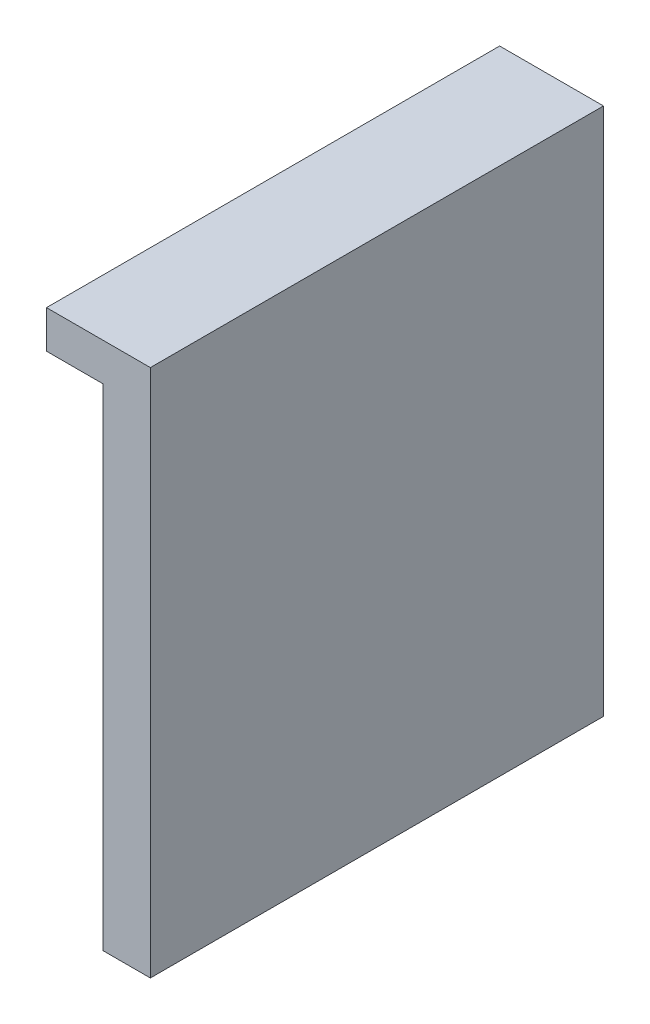
ISO-10303-21;
HEADER;
FILE_DESCRIPTION(('STEP AP214'),'2;1');
FILE_NAME('part.step','',(''),(''),'','','');
FILE_SCHEMA(('AUTOMOTIVE_DESIGN { 1 0 10303 214 1 1 1 1 }'));
ENDSEC;
DATA;
#1=APPLICATION_CONTEXT('core data for automotive mechanical design processes');
#2=APPLICATION_PROTOCOL_DEFINITION('international standard','automotive_design',2000,#1);
#3=PRODUCT_CONTEXT('',#1,'mechanical');
#4=PRODUCT('Part','Part','',(#3));
#5=PRODUCT_RELATED_PRODUCT_CATEGORY('part','',(#4));
#6=PRODUCT_DEFINITION_FORMATION('','',#4);
#7=PRODUCT_DEFINITION_CONTEXT('part definition',#1,'design');
#8=PRODUCT_DEFINITION('design','',#6,#7);
#9=PRODUCT_DEFINITION_SHAPE('','',#8);
#10=(LENGTH_UNIT() NAMED_UNIT(*) SI_UNIT(.MILLI.,.METRE.));
#11=(NAMED_UNIT(*) PLANE_ANGLE_UNIT() SI_UNIT($,.RADIAN.));
#12=(NAMED_UNIT(*) SI_UNIT($,.STERADIAN.) SOLID_ANGLE_UNIT());
#13=UNCERTAINTY_MEASURE_WITH_UNIT(LENGTH_MEASURE(1.E-05),#10,'distance_accuracy_value','');
#14=(GEOMETRIC_REPRESENTATION_CONTEXT(3) GLOBAL_UNCERTAINTY_ASSIGNED_CONTEXT((#13)) GLOBAL_UNIT_ASSIGNED_CONTEXT((#10,
#11,#12)) REPRESENTATION_CONTEXT('',''));
#15=CARTESIAN_POINT('',(0.,0.,0.));
#16=DIRECTION('',(0.,0.,1.));
#17=DIRECTION('',(1.,0.,0.));
#18=AXIS2_PLACEMENT_3D('',#15,#16,#17);
#19=CARTESIAN_POINT('',(0.,23.,-24.));
#20=DIRECTION('',(0.,0.,-1.));
#21=DIRECTION('',(-1.,0.,0.));
#22=AXIS2_PLACEMENT_3D('',#19,#20,#21);
#23=PLANE('',#22);
#24=DIRECTION('',(-1.,0.,0.));
#25=VECTOR('',#24,1.);
#26=CARTESIAN_POINT('',(3.,25.,-24.));
#27=LINE('',#26,#25);
#28=CARTESIAN_POINT('',(2.5,25.,-24.));
#29=VERTEX_POINT('',#28);
#30=CARTESIAN_POINT('',(-3.,25.,-24.));
#31=VERTEX_POINT('',#30);
#32=EDGE_CURVE('E130',#29,#31,#27,.T.);
#33=ORIENTED_EDGE('',*,*,#32,.F.);
#34=DIRECTION('',(0.,1.,0.));
#35=VECTOR('',#34,1.);
#36=CARTESIAN_POINT('',(2.5,25.,-24.));
#37=LINE('',#36,#35);
#38=CARTESIAN_POINT('',(2.5,-3.,-24.));
#39=VERTEX_POINT('',#38);
#40=EDGE_CURVE('E104',#39,#29,#37,.T.);
#41=ORIENTED_EDGE('',*,*,#40,.F.);
#42=DIRECTION('',(1.,0.,0.));
#43=VECTOR('',#42,1.);
#44=CARTESIAN_POINT('',(0.,-3.,-24.));
#45=LINE('',#44,#43);
#46=CARTESIAN_POINT('',(0.,-3.,-24.));
#47=VERTEX_POINT('',#46);
#48=EDGE_CURVE('E102',#47,#39,#45,.T.);
#49=ORIENTED_EDGE('',*,*,#48,.F.);
#50=DIRECTION('',(0.,-1.,0.));
#51=VECTOR('',#50,1.);
#52=CARTESIAN_POINT('',(0.,23.,-24.));
#53=LINE('',#52,#51);
#54=CARTESIAN_POINT('',(0.,23.,-24.));
#55=VERTEX_POINT('',#54);
#56=EDGE_CURVE('E11',#55,#47,#53,.T.);
#57=ORIENTED_EDGE('',*,*,#56,.F.);
#58=DIRECTION('',(-1.,0.,0.));
#59=VECTOR('',#58,1.);
#60=CARTESIAN_POINT('',(3.,23.,-24.));
#61=LINE('',#60,#59);
#62=CARTESIAN_POINT('',(-3.,23.,-24.));
#63=VERTEX_POINT('',#62);
#64=EDGE_CURVE('E60',#55,#63,#61,.T.);
#65=ORIENTED_EDGE('',*,*,#64,.T.);
#66=DIRECTION('',(0.,-1.,0.));
#67=VECTOR('',#66,1.);
#68=CARTESIAN_POINT('',(-3.,25.,-24.));
#69=LINE('',#68,#67);
#70=EDGE_CURVE('E152',#31,#63,#69,.T.);
#71=ORIENTED_EDGE('',*,*,#70,.F.);
#72=EDGE_LOOP('',(#33,#41,#49,#57,#65,#71));
#73=FACE_BOUND('',#72,.T.);
#74=ADVANCED_FACE('F45',(#73),#23,.T.);
#75=CARTESIAN_POINT('',(0.,23.,0.));
#76=DIRECTION('',(0.,0.,-1.));
#77=DIRECTION('',(-1.,0.,0.));
#78=AXIS2_PLACEMENT_3D('',#75,#76,#77);
#79=PLANE('',#78);
#80=DIRECTION('',(0.,-1.,0.));
#81=VECTOR('',#80,1.);
#82=CARTESIAN_POINT('',(2.5,25.,0.));
#83=LINE('',#82,#81);
#84=CARTESIAN_POINT('',(2.5,25.,0.));
#85=VERTEX_POINT('',#84);
#86=CARTESIAN_POINT('',(2.5,-3.,0.));
#87=VERTEX_POINT('',#86);
#88=EDGE_CURVE('E122',#85,#87,#83,.T.);
#89=ORIENTED_EDGE('',*,*,#88,.F.);
#90=DIRECTION('',(-1.,0.,0.));
#91=VECTOR('',#90,1.);
#92=CARTESIAN_POINT('',(3.,25.,0.));
#93=LINE('',#92,#91);
#94=CARTESIAN_POINT('',(-3.,25.,0.));
#95=VERTEX_POINT('',#94);
#96=EDGE_CURVE('E138',#85,#95,#93,.T.);
#97=ORIENTED_EDGE('',*,*,#96,.T.);
#98=DIRECTION('',(0.,-1.,0.));
#99=VECTOR('',#98,1.);
#100=CARTESIAN_POINT('',(-3.,25.,0.));
#101=LINE('',#100,#99);
#102=CARTESIAN_POINT('',(-3.,23.,0.));
#103=VERTEX_POINT('',#102);
#104=EDGE_CURVE('E141',#95,#103,#101,.T.);
#105=ORIENTED_EDGE('',*,*,#104,.T.);
#106=DIRECTION('',(-1.,0.,0.));
#107=VECTOR('',#106,1.);
#108=CARTESIAN_POINT('',(3.,23.,0.));
#109=LINE('',#108,#107);
#110=CARTESIAN_POINT('',(0.,23.,0.));
#111=VERTEX_POINT('',#110);
#112=EDGE_CURVE('E134',#111,#103,#109,.T.);
#113=ORIENTED_EDGE('',*,*,#112,.F.);
#114=DIRECTION('',(0.,-1.,0.));
#115=VECTOR('',#114,1.);
#116=CARTESIAN_POINT('',(0.,23.,0.));
#117=LINE('',#116,#115);
#118=CARTESIAN_POINT('',(0.,-3.,0.));
#119=VERTEX_POINT('',#118);
#120=EDGE_CURVE('E48',#111,#119,#117,.T.);
#121=ORIENTED_EDGE('',*,*,#120,.T.);
#122=DIRECTION('',(-1.,0.,0.));
#123=VECTOR('',#122,1.);
#124=CARTESIAN_POINT('',(0.,-3.,0.));
#125=LINE('',#124,#123);
#126=EDGE_CURVE('E114',#87,#119,#125,.T.);
#127=ORIENTED_EDGE('',*,*,#126,.F.);
#128=EDGE_LOOP('',(#89,#97,#105,#113,#121,#127));
#129=FACE_BOUND('',#128,.T.);
#130=ADVANCED_FACE('F160',(#129),#79,.F.);
#131=CARTESIAN_POINT('',(0.,25.,0.));
#132=DIRECTION('',(0.,-1.,0.));
#133=DIRECTION('',(0.,0.,-1.));
#134=AXIS2_PLACEMENT_3D('',#131,#132,#133);
#135=PLANE('',#134);
#136=DIRECTION('',(0.,0.,1.));
#137=VECTOR('',#136,1.);
#138=CARTESIAN_POINT('',(2.5,25.,0.));
#139=LINE('',#138,#137);
#140=EDGE_CURVE('E127',#29,#85,#139,.T.);
#141=ORIENTED_EDGE('',*,*,#140,.F.);
#142=ORIENTED_EDGE('',*,*,#32,.T.);
#143=DIRECTION('',(0.,0.,-1.));
#144=VECTOR('',#143,1.);
#145=CARTESIAN_POINT('',(-3.,25.,0.));
#146=LINE('',#145,#144);
#147=EDGE_CURVE('E133',#95,#31,#146,.T.);
#148=ORIENTED_EDGE('',*,*,#147,.F.);
#149=ORIENTED_EDGE('',*,*,#96,.F.);
#150=EDGE_LOOP('',(#141,#142,#148,#149));
#151=FACE_BOUND('',#150,.T.);
#152=ADVANCED_FACE('F170',(#151),#135,.F.);
#153=CARTESIAN_POINT('',(0.,23.,0.));
#154=DIRECTION('',(-1.,0.,0.));
#155=DIRECTION('',(0.,0.,1.));
#156=AXIS2_PLACEMENT_3D('',#153,#154,#155);
#157=PLANE('',#156);
#158=ORIENTED_EDGE('',*,*,#56,.T.);
#159=DIRECTION('',(0.,0.,-1.));
#160=VECTOR('',#159,1.);
#161=CARTESIAN_POINT('',(0.,-3.,0.));
#162=LINE('',#161,#160);
#163=EDGE_CURVE('E99',#119,#47,#162,.T.);
#164=ORIENTED_EDGE('',*,*,#163,.F.);
#165=ORIENTED_EDGE('',*,*,#120,.F.);
#166=DIRECTION('',(0.,0.,-1.));
#167=VECTOR('',#166,1.);
#168=CARTESIAN_POINT('',(0.,23.,0.));
#169=LINE('',#168,#167);
#170=EDGE_CURVE('E65',#111,#55,#169,.T.);
#171=ORIENTED_EDGE('',*,*,#170,.T.);
#172=EDGE_LOOP('',(#158,#164,#165,#171));
#173=FACE_BOUND('',#172,.T.);
#174=ADVANCED_FACE('F96',(#173),#157,.T.);
#175=CARTESIAN_POINT('',(0.,23.,0.));
#176=DIRECTION('',(0.,-1.,0.));
#177=DIRECTION('',(0.,0.,-1.));
#178=AXIS2_PLACEMENT_3D('',#175,#176,#177);
#179=PLANE('',#178);
#180=ORIENTED_EDGE('',*,*,#170,.F.);
#181=ORIENTED_EDGE('',*,*,#112,.T.);
#182=DIRECTION('',(0.,0.,-1.));
#183=VECTOR('',#182,1.);
#184=CARTESIAN_POINT('',(-3.,23.,0.));
#185=LINE('',#184,#183);
#186=EDGE_CURVE('E144',#103,#63,#185,.T.);
#187=ORIENTED_EDGE('',*,*,#186,.T.);
#188=ORIENTED_EDGE('',*,*,#64,.F.);
#189=EDGE_LOOP('',(#180,#181,#187,#188));
#190=FACE_BOUND('',#189,.T.);
#191=ADVANCED_FACE('F163',(#190),#179,.T.);
#192=CARTESIAN_POINT('',(-3.,25.,0.));
#193=DIRECTION('',(-1.,0.,0.));
#194=DIRECTION('',(0.,0.,1.));
#195=AXIS2_PLACEMENT_3D('',#192,#193,#194);
#196=PLANE('',#195);
#197=ORIENTED_EDGE('',*,*,#186,.F.);
#198=ORIENTED_EDGE('',*,*,#104,.F.);
#199=ORIENTED_EDGE('',*,*,#147,.T.);
#200=ORIENTED_EDGE('',*,*,#70,.T.);
#201=EDGE_LOOP('',(#197,#198,#199,#200));
#202=FACE_BOUND('',#201,.T.);
#203=ADVANCED_FACE('F165',(#202),#196,.T.);
#204=CARTESIAN_POINT('',(2.5,0.,0.));
#205=DIRECTION('',(1.,0.,0.));
#206=DIRECTION('',(0.,0.,-1.));
#207=AXIS2_PLACEMENT_3D('',#204,#205,#206);
#208=PLANE('',#207);
#209=ORIENTED_EDGE('',*,*,#88,.T.);
#210=DIRECTION('',(0.,0.,1.));
#211=VECTOR('',#210,1.);
#212=CARTESIAN_POINT('',(2.5,-3.,0.));
#213=LINE('',#212,#211);
#214=EDGE_CURVE('E109',#39,#87,#213,.T.);
#215=ORIENTED_EDGE('',*,*,#214,.F.);
#216=ORIENTED_EDGE('',*,*,#40,.T.);
#217=ORIENTED_EDGE('',*,*,#140,.T.);
#218=EDGE_LOOP('',(#209,#215,#216,#217));
#219=FACE_BOUND('',#218,.T.);
#220=ADVANCED_FACE('F173',(#219),#208,.T.);
#221=CARTESIAN_POINT('',(0.,-3.,0.));
#222=DIRECTION('',(0.,-1.,0.));
#223=DIRECTION('',(0.,0.,-1.));
#224=AXIS2_PLACEMENT_3D('',#221,#222,#223);
#225=PLANE('',#224);
#226=ORIENTED_EDGE('',*,*,#163,.T.);
#227=ORIENTED_EDGE('',*,*,#48,.T.);
#228=ORIENTED_EDGE('',*,*,#214,.T.);
#229=ORIENTED_EDGE('',*,*,#126,.T.);
#230=EDGE_LOOP('',(#226,#227,#228,#229));
#231=FACE_BOUND('',#230,.T.);
#232=ADVANCED_FACE('F112',(#231),#225,.T.);
#233=CLOSED_SHELL('',(#74,#130,#152,#174,#191,#203,#220,#232));
#234=MANIFOLD_SOLID_BREP('B2',#233);
#235=ADVANCED_BREP_SHAPE_REPRESENTATION('',(#18,#234),#14);
#236=SHAPE_DEFINITION_REPRESENTATION(#9,#235);
ENDSEC;
END-ISO-10303-21;
